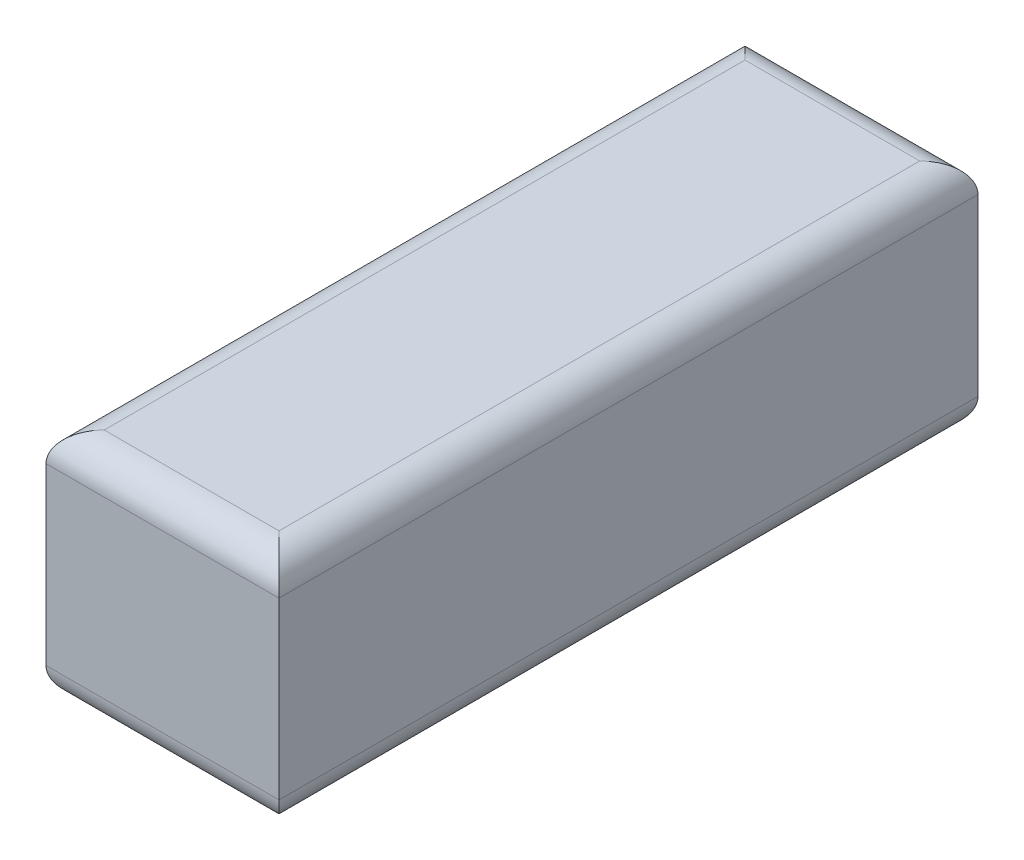
ISO-10303-21;
HEADER;
FILE_DESCRIPTION(('STEP AP214'),'2;1');
FILE_NAME('part.step','',(''),(''),'','','');
FILE_SCHEMA(('AUTOMOTIVE_DESIGN { 1 0 10303 214 1 1 1 1 }'));
ENDSEC;
DATA;
#1=APPLICATION_CONTEXT('core data for automotive mechanical design processes');
#2=APPLICATION_PROTOCOL_DEFINITION('international standard','automotive_design',2000,#1);
#3=PRODUCT_CONTEXT('',#1,'mechanical');
#4=PRODUCT('Part','Part','',(#3));
#5=PRODUCT_RELATED_PRODUCT_CATEGORY('part','',(#4));
#6=PRODUCT_DEFINITION_FORMATION('','',#4);
#7=PRODUCT_DEFINITION_CONTEXT('part definition',#1,'design');
#8=PRODUCT_DEFINITION('design','',#6,#7);
#9=PRODUCT_DEFINITION_SHAPE('','',#8);
#10=(LENGTH_UNIT() NAMED_UNIT(*) SI_UNIT(.MILLI.,.METRE.));
#11=(NAMED_UNIT(*) PLANE_ANGLE_UNIT() SI_UNIT($,.RADIAN.));
#12=(NAMED_UNIT(*) SI_UNIT($,.STERADIAN.) SOLID_ANGLE_UNIT());
#13=UNCERTAINTY_MEASURE_WITH_UNIT(LENGTH_MEASURE(1.E-05),#10,'distance_accuracy_value','');
#14=(GEOMETRIC_REPRESENTATION_CONTEXT(3) GLOBAL_UNCERTAINTY_ASSIGNED_CONTEXT((#13)) GLOBAL_UNIT_ASSIGNED_CONTEXT((#10,
#11,#12)) REPRESENTATION_CONTEXT('',''));
#15=CARTESIAN_POINT('',(0.,0.,0.));
#16=DIRECTION('',(0.,0.,1.));
#17=DIRECTION('',(1.,0.,0.));
#18=AXIS2_PLACEMENT_3D('',#15,#16,#17);
#19=CARTESIAN_POINT('',(-304.8,-304.8,1828.8));
#20=DIRECTION('',(1.,0.,0.));
#21=DIRECTION('',(0.,0.,-1.));
#22=AXIS2_PLACEMENT_3D('',#19,#20,#21);
#23=PLANE('',#22);
#24=DIRECTION('',(0.,-1.,0.));
#25=VECTOR('',#24,1.);
#26=CARTESIAN_POINT('',(-304.8,-304.8,0.));
#27=LINE('',#26,#25);
#28=CARTESIAN_POINT('',(-304.8,228.6,0.));
#29=VERTEX_POINT('',#28);
#30=CARTESIAN_POINT('',(-304.8,-228.6,0.));
#31=VERTEX_POINT('',#30);
#32=EDGE_CURVE('E138',#29,#31,#27,.T.);
#33=ORIENTED_EDGE('',*,*,#32,.T.);
#34=DIRECTION('',(0.,0.,-1.));
#35=VECTOR('',#34,1.);
#36=CARTESIAN_POINT('',(-304.8,-228.6,1828.8));
#37=LINE('',#36,#35);
#38=CARTESIAN_POINT('',(-304.8,-228.6,1828.8));
#39=VERTEX_POINT('',#38);
#40=EDGE_CURVE('E186',#31,#39,#37,.F.);
#41=ORIENTED_EDGE('',*,*,#40,.T.);
#42=DIRECTION('',(0.,-1.,0.));
#43=VECTOR('',#42,1.);
#44=CARTESIAN_POINT('',(-304.8,-304.8,1828.8));
#45=LINE('',#44,#43);
#46=CARTESIAN_POINT('',(-304.8,228.6,1828.8));
#47=VERTEX_POINT('',#46);
#48=EDGE_CURVE('E148',#47,#39,#45,.T.);
#49=ORIENTED_EDGE('',*,*,#48,.F.);
#50=DIRECTION('',(0.,0.,-1.));
#51=VECTOR('',#50,1.);
#52=CARTESIAN_POINT('',(-304.8,228.6,1828.8));
#53=LINE('',#52,#51);
#54=EDGE_CURVE('E183',#47,#29,#53,.T.);
#55=ORIENTED_EDGE('',*,*,#54,.T.);
#56=EDGE_LOOP('',(#33,#41,#49,#55));
#57=FACE_BOUND('',#56,.T.);
#58=ADVANCED_FACE('F49',(#57),#23,.F.);
#59=CARTESIAN_POINT('',(304.8,-304.8,1828.8));
#60=DIRECTION('',(0.,1.,0.));
#61=DIRECTION('',(-1.,0.,0.));
#62=AXIS2_PLACEMENT_3D('',#59,#60,#61);
#63=PLANE('',#62);
#64=DIRECTION('',(1.,0.,0.));
#65=VECTOR('',#64,1.);
#66=CARTESIAN_POINT('',(-304.8,-304.8,1752.6));
#67=LINE('',#66,#65);
#68=CARTESIAN_POINT('',(228.6,-304.8,1752.6));
#69=VERTEX_POINT('',#68);
#70=CARTESIAN_POINT('',(-228.6,-304.8,1752.6));
#71=VERTEX_POINT('',#70);
#72=EDGE_CURVE('E169',#69,#71,#67,.F.);
#73=ORIENTED_EDGE('',*,*,#72,.T.);
#74=DIRECTION('',(0.,0.,-1.));
#75=VECTOR('',#74,1.);
#76=CARTESIAN_POINT('',(-228.6,-304.8,1828.8));
#77=LINE('',#76,#75);
#78=CARTESIAN_POINT('',(-228.6,-304.8,76.2));
#79=VERTEX_POINT('',#78);
#80=EDGE_CURVE('E176',#71,#79,#77,.T.);
#81=ORIENTED_EDGE('',*,*,#80,.T.);
#82=DIRECTION('',(1.,0.,0.));
#83=VECTOR('',#82,1.);
#84=CARTESIAN_POINT('',(304.8,-304.8,76.2));
#85=LINE('',#84,#83);
#86=CARTESIAN_POINT('',(228.6,-304.8,76.2));
#87=VERTEX_POINT('',#86);
#88=EDGE_CURVE('E172',#79,#87,#85,.T.);
#89=ORIENTED_EDGE('',*,*,#88,.T.);
#90=DIRECTION('',(0.,0.,-1.));
#91=VECTOR('',#90,1.);
#92=CARTESIAN_POINT('',(228.6,-304.8,1828.8));
#93=LINE('',#92,#91);
#94=EDGE_CURVE('E166',#87,#69,#93,.F.);
#95=ORIENTED_EDGE('',*,*,#94,.T.);
#96=EDGE_LOOP('',(#73,#81,#89,#95));
#97=FACE_BOUND('',#96,.T.);
#98=ADVANCED_FACE('F235',(#97),#63,.F.);
#99=CARTESIAN_POINT('',(304.8,-304.8,1828.8));
#100=DIRECTION('',(-1.,0.,0.));
#101=DIRECTION('',(0.,0.,1.));
#102=AXIS2_PLACEMENT_3D('',#99,#100,#101);
#103=PLANE('',#102);
#104=DIRECTION('',(0.,1.,0.));
#105=VECTOR('',#104,1.);
#106=CARTESIAN_POINT('',(304.8,-304.8,0.));
#107=LINE('',#106,#105);
#108=CARTESIAN_POINT('',(304.8,-228.6,0.));
#109=VERTEX_POINT('',#108);
#110=CARTESIAN_POINT('',(304.8,228.6,0.));
#111=VERTEX_POINT('',#110);
#112=EDGE_CURVE('E151',#109,#111,#107,.T.);
#113=ORIENTED_EDGE('',*,*,#112,.T.);
#114=DIRECTION('',(0.,0.,-1.));
#115=VECTOR('',#114,1.);
#116=CARTESIAN_POINT('',(304.8,228.6,1828.8));
#117=LINE('',#116,#115);
#118=CARTESIAN_POINT('',(304.8,228.6,1828.8));
#119=VERTEX_POINT('',#118);
#120=EDGE_CURVE('E11',#111,#119,#117,.F.);
#121=ORIENTED_EDGE('',*,*,#120,.T.);
#122=DIRECTION('',(0.,1.,0.));
#123=VECTOR('',#122,1.);
#124=CARTESIAN_POINT('',(304.8,-304.8,1828.8));
#125=LINE('',#124,#123);
#126=CARTESIAN_POINT('',(304.8,-228.6,1828.8));
#127=VERTEX_POINT('',#126);
#128=EDGE_CURVE('E145',#127,#119,#125,.T.);
#129=ORIENTED_EDGE('',*,*,#128,.F.);
#130=DIRECTION('',(0.,0.,-1.));
#131=VECTOR('',#130,1.);
#132=CARTESIAN_POINT('',(304.8,-228.6,1828.8));
#133=LINE('',#132,#131);
#134=EDGE_CURVE('E59',#127,#109,#133,.T.);
#135=ORIENTED_EDGE('',*,*,#134,.T.);
#136=EDGE_LOOP('',(#113,#121,#129,#135));
#137=FACE_BOUND('',#136,.T.);
#138=ADVANCED_FACE('F223',(#137),#103,.F.);
#139=CARTESIAN_POINT('',(304.8,304.8,1828.8));
#140=DIRECTION('',(0.,-1.,0.));
#141=DIRECTION('',(1.,0.,0.));
#142=AXIS2_PLACEMENT_3D('',#139,#140,#141);
#143=PLANE('',#142);
#144=DIRECTION('',(-1.,0.,0.));
#145=VECTOR('',#144,1.);
#146=CARTESIAN_POINT('',(304.8,304.8,76.2));
#147=LINE('',#146,#145);
#148=CARTESIAN_POINT('',(228.6,304.8,76.2));
#149=VERTEX_POINT('',#148);
#150=CARTESIAN_POINT('',(-228.6,304.8,76.2));
#151=VERTEX_POINT('',#150);
#152=EDGE_CURVE('E129',#149,#151,#147,.T.);
#153=ORIENTED_EDGE('',*,*,#152,.T.);
#154=DIRECTION('',(0.,0.,-1.));
#155=VECTOR('',#154,1.);
#156=CARTESIAN_POINT('',(-228.6,304.8,1828.8));
#157=LINE('',#156,#155);
#158=CARTESIAN_POINT('',(-228.6,304.8,1752.6));
#159=VERTEX_POINT('',#158);
#160=EDGE_CURVE('E124',#151,#159,#157,.F.);
#161=ORIENTED_EDGE('',*,*,#160,.T.);
#162=DIRECTION('',(-1.,0.,0.));
#163=VECTOR('',#162,1.);
#164=CARTESIAN_POINT('',(304.8,304.8,1752.6));
#165=LINE('',#164,#163);
#166=CARTESIAN_POINT('',(228.6,304.8,1752.6));
#167=VERTEX_POINT('',#166);
#168=EDGE_CURVE('E116',#159,#167,#165,.F.);
#169=ORIENTED_EDGE('',*,*,#168,.T.);
#170=DIRECTION('',(0.,0.,-1.));
#171=VECTOR('',#170,1.);
#172=CARTESIAN_POINT('',(228.6,304.8,1828.8));
#173=LINE('',#172,#171);
#174=EDGE_CURVE('E121',#167,#149,#173,.T.);
#175=ORIENTED_EDGE('',*,*,#174,.T.);
#176=EDGE_LOOP('',(#153,#161,#169,#175));
#177=FACE_BOUND('',#176,.T.);
#178=ADVANCED_FACE('F119',(#177),#143,.F.);
#179=CARTESIAN_POINT('',(0.,0.,1828.8));
#180=DIRECTION('',(0.,0.,1.));
#181=DIRECTION('',(1.,0.,0.));
#182=AXIS2_PLACEMENT_3D('',#179,#180,#181);
#183=PLANE('',#182);
#184=ORIENTED_EDGE('',*,*,#128,.T.);
#185=DIRECTION('',(-1.,0.,0.));
#186=VECTOR('',#185,1.);
#187=CARTESIAN_POINT('',(-304.8,228.6,1828.8));
#188=LINE('',#187,#186);
#189=EDGE_CURVE('E135',#119,#47,#188,.T.);
#190=ORIENTED_EDGE('',*,*,#189,.T.);
#191=ORIENTED_EDGE('',*,*,#48,.T.);
#192=DIRECTION('',(1.,0.,0.));
#193=VECTOR('',#192,1.);
#194=CARTESIAN_POINT('',(304.8,-228.6,1828.8));
#195=LINE('',#194,#193);
#196=EDGE_CURVE('E72',#39,#127,#195,.T.);
#197=ORIENTED_EDGE('',*,*,#196,.T.);
#198=EDGE_LOOP('',(#184,#190,#191,#197));
#199=FACE_BOUND('',#198,.T.);
#200=ADVANCED_FACE('F297',(#199),#183,.T.);
#201=CARTESIAN_POINT('',(0.,0.,0.));
#202=DIRECTION('',(0.,0.,1.));
#203=DIRECTION('',(1.,0.,0.));
#204=AXIS2_PLACEMENT_3D('',#201,#202,#203);
#205=PLANE('',#204);
#206=ORIENTED_EDGE('',*,*,#32,.F.);
#207=DIRECTION('',(-1.,0.,0.));
#208=VECTOR('',#207,1.);
#209=CARTESIAN_POINT('',(0.,228.6,0.));
#210=LINE('',#209,#208);
#211=EDGE_CURVE('E162',#29,#111,#210,.F.);
#212=ORIENTED_EDGE('',*,*,#211,.T.);
#213=ORIENTED_EDGE('',*,*,#112,.F.);
#214=DIRECTION('',(1.,0.,0.));
#215=VECTOR('',#214,1.);
#216=CARTESIAN_POINT('',(0.,-228.6,0.));
#217=LINE('',#216,#215);
#218=EDGE_CURVE('E158',#109,#31,#217,.F.);
#219=ORIENTED_EDGE('',*,*,#218,.T.);
#220=EDGE_LOOP('',(#206,#212,#213,#219));
#221=FACE_BOUND('',#220,.T.);
#222=ADVANCED_FACE('F227',(#221),#205,.F.);
#223=CARTESIAN_POINT('',(0.,228.6,1752.6));
#224=DIRECTION('',(1.,0.,0.));
#225=DIRECTION('',(0.,1.,0.));
#226=AXIS2_PLACEMENT_3D('',#223,#224,#225);
#227=CYLINDRICAL_SURFACE('',#226,76.2);
#228=CARTESIAN_POINT('',(-228.6,228.6,1752.6));
#229=DIRECTION('',(-0.707106781186547,0.,-0.707106781186547));
#230=DIRECTION('',(0.707106781186547,0.,-0.707106781186547));
#231=AXIS2_PLACEMENT_3D('',#228,#229,#230);
#232=ELLIPSE('',#231,107.76307345283,76.2);
#233=EDGE_CURVE('E139',#47,#159,#232,.T.);
#234=ORIENTED_EDGE('',*,*,#233,.F.);
#235=ORIENTED_EDGE('',*,*,#189,.F.);
#236=CARTESIAN_POINT('',(228.6,228.6,1752.6));
#237=DIRECTION('',(0.707106781186547,0.,-0.707106781186547));
#238=DIRECTION('',(-0.707106781186547,0.,-0.707106781186547));
#239=AXIS2_PLACEMENT_3D('',#236,#237,#238);
#240=ELLIPSE('',#239,107.76307345283,76.2);
#241=EDGE_CURVE('E133',#167,#119,#240,.T.);
#242=ORIENTED_EDGE('',*,*,#241,.F.);
#243=ORIENTED_EDGE('',*,*,#168,.F.);
#244=EDGE_LOOP('',(#234,#235,#242,#243));
#245=FACE_BOUND('',#244,.T.);
#246=ADVANCED_FACE('F134',(#245),#227,.T.);
#247=CARTESIAN_POINT('',(228.6,228.6,1828.8));
#248=DIRECTION('',(0.,0.,-1.));
#249=DIRECTION('',(-1.,0.,0.));
#250=AXIS2_PLACEMENT_3D('',#247,#248,#249);
#251=CYLINDRICAL_SURFACE('',#250,76.2);
#252=ORIENTED_EDGE('',*,*,#241,.T.);
#253=ORIENTED_EDGE('',*,*,#120,.F.);
#254=CARTESIAN_POINT('',(228.6,228.6,76.2));
#255=DIRECTION('',(-0.707106781186547,0.,-0.707106781186547));
#256=DIRECTION('',(0.707106781186547,0.,-0.707106781186547));
#257=AXIS2_PLACEMENT_3D('',#254,#255,#256);
#258=ELLIPSE('',#257,107.76307345283,76.2);
#259=EDGE_CURVE('E142',#149,#111,#258,.T.);
#260=ORIENTED_EDGE('',*,*,#259,.F.);
#261=ORIENTED_EDGE('',*,*,#174,.F.);
#262=EDGE_LOOP('',(#252,#253,#260,#261));
#263=FACE_BOUND('',#262,.T.);
#264=ADVANCED_FACE('F141',(#263),#251,.T.);
#265=CARTESIAN_POINT('',(-228.6,228.6,1828.8));
#266=DIRECTION('',(0.,0.,-1.));
#267=DIRECTION('',(-1.,0.,0.));
#268=AXIS2_PLACEMENT_3D('',#265,#266,#267);
#269=CYLINDRICAL_SURFACE('',#268,76.2);
#270=ORIENTED_EDGE('',*,*,#233,.T.);
#271=ORIENTED_EDGE('',*,*,#160,.F.);
#272=CARTESIAN_POINT('',(-228.6,228.6,76.2));
#273=DIRECTION('',(0.707106781186547,0.,-0.707106781186547));
#274=DIRECTION('',(-0.707106781186547,0.,-0.707106781186547));
#275=AXIS2_PLACEMENT_3D('',#272,#273,#274);
#276=ELLIPSE('',#275,107.76307345283,76.2);
#277=EDGE_CURVE('E191',#29,#151,#276,.T.);
#278=ORIENTED_EDGE('',*,*,#277,.F.);
#279=ORIENTED_EDGE('',*,*,#54,.F.);
#280=EDGE_LOOP('',(#270,#271,#278,#279));
#281=FACE_BOUND('',#280,.T.);
#282=ADVANCED_FACE('F250',(#281),#269,.T.);
#283=CARTESIAN_POINT('',(304.8,228.6,76.2));
#284=DIRECTION('',(-1.,0.,0.));
#285=DIRECTION('',(0.,-1.,0.));
#286=AXIS2_PLACEMENT_3D('',#283,#284,#285);
#287=CYLINDRICAL_SURFACE('',#286,76.2);
#288=ORIENTED_EDGE('',*,*,#259,.T.);
#289=ORIENTED_EDGE('',*,*,#211,.F.);
#290=ORIENTED_EDGE('',*,*,#277,.T.);
#291=ORIENTED_EDGE('',*,*,#152,.F.);
#292=EDGE_LOOP('',(#288,#289,#290,#291));
#293=FACE_BOUND('',#292,.T.);
#294=ADVANCED_FACE('F247',(#293),#287,.T.);
#295=CARTESIAN_POINT('',(0.,-228.6,1752.6));
#296=DIRECTION('',(-1.,0.,0.));
#297=DIRECTION('',(0.,-1.,0.));
#298=AXIS2_PLACEMENT_3D('',#295,#296,#297);
#299=CYLINDRICAL_SURFACE('',#298,76.2);
#300=CARTESIAN_POINT('',(228.6,-228.6,1752.6));
#301=DIRECTION('',(0.707106781186547,0.,-0.707106781186547));
#302=DIRECTION('',(-0.707106781186547,0.,-0.707106781186547));
#303=AXIS2_PLACEMENT_3D('',#300,#301,#302);
#304=ELLIPSE('',#303,107.76307345283,76.2);
#305=EDGE_CURVE('E203',#127,#69,#304,.T.);
#306=ORIENTED_EDGE('',*,*,#305,.F.);
#307=ORIENTED_EDGE('',*,*,#196,.F.);
#308=CARTESIAN_POINT('',(-228.6,-228.6,1752.6));
#309=DIRECTION('',(-0.707106781186547,0.,-0.707106781186547));
#310=DIRECTION('',(0.707106781186547,0.,-0.707106781186547));
#311=AXIS2_PLACEMENT_3D('',#308,#309,#310);
#312=ELLIPSE('',#311,107.76307345283,76.2);
#313=EDGE_CURVE('E53',#71,#39,#312,.T.);
#314=ORIENTED_EDGE('',*,*,#313,.F.);
#315=ORIENTED_EDGE('',*,*,#72,.F.);
#316=EDGE_LOOP('',(#306,#307,#314,#315));
#317=FACE_BOUND('',#316,.T.);
#318=ADVANCED_FACE('F51',(#317),#299,.T.);
#319=CARTESIAN_POINT('',(-228.6,-228.6,1828.8));
#320=DIRECTION('',(0.,0.,-1.));
#321=DIRECTION('',(-1.,0.,0.));
#322=AXIS2_PLACEMENT_3D('',#319,#320,#321);
#323=CYLINDRICAL_SURFACE('',#322,76.2);
#324=ORIENTED_EDGE('',*,*,#313,.T.);
#325=ORIENTED_EDGE('',*,*,#40,.F.);
#326=CARTESIAN_POINT('',(-228.6,-228.6,76.2));
#327=DIRECTION('',(0.707106781186547,0.,-0.707106781186547));
#328=DIRECTION('',(-0.707106781186547,0.,-0.707106781186547));
#329=AXIS2_PLACEMENT_3D('',#326,#327,#328);
#330=ELLIPSE('',#329,107.76307345283,76.2);
#331=EDGE_CURVE('E201',#79,#31,#330,.T.);
#332=ORIENTED_EDGE('',*,*,#331,.F.);
#333=ORIENTED_EDGE('',*,*,#80,.F.);
#334=EDGE_LOOP('',(#324,#325,#332,#333));
#335=FACE_BOUND('',#334,.T.);
#336=ADVANCED_FACE('F216',(#335),#323,.T.);
#337=CARTESIAN_POINT('',(228.6,-228.6,1828.8));
#338=DIRECTION('',(0.,0.,-1.));
#339=DIRECTION('',(-1.,0.,0.));
#340=AXIS2_PLACEMENT_3D('',#337,#338,#339);
#341=CYLINDRICAL_SURFACE('',#340,76.2);
#342=ORIENTED_EDGE('',*,*,#305,.T.);
#343=ORIENTED_EDGE('',*,*,#94,.F.);
#344=CARTESIAN_POINT('',(228.6,-228.6,76.2));
#345=DIRECTION('',(-0.707106781186547,0.,-0.707106781186547));
#346=DIRECTION('',(0.707106781186547,0.,-0.707106781186547));
#347=AXIS2_PLACEMENT_3D('',#344,#345,#346);
#348=ELLIPSE('',#347,107.76307345283,76.2);
#349=EDGE_CURVE('E198',#109,#87,#348,.T.);
#350=ORIENTED_EDGE('',*,*,#349,.F.);
#351=ORIENTED_EDGE('',*,*,#134,.F.);
#352=EDGE_LOOP('',(#342,#343,#350,#351));
#353=FACE_BOUND('',#352,.T.);
#354=ADVANCED_FACE('F221',(#353),#341,.T.);
#355=CARTESIAN_POINT('',(304.8,-228.6,76.2));
#356=DIRECTION('',(1.,0.,0.));
#357=DIRECTION('',(0.,1.,0.));
#358=AXIS2_PLACEMENT_3D('',#355,#356,#357);
#359=CYLINDRICAL_SURFACE('',#358,76.2);
#360=ORIENTED_EDGE('',*,*,#331,.T.);
#361=ORIENTED_EDGE('',*,*,#218,.F.);
#362=ORIENTED_EDGE('',*,*,#349,.T.);
#363=ORIENTED_EDGE('',*,*,#88,.F.);
#364=EDGE_LOOP('',(#360,#361,#362,#363));
#365=FACE_BOUND('',#364,.T.);
#366=ADVANCED_FACE('F232',(#365),#359,.T.);
#367=CLOSED_SHELL('',(#58,#98,#138,#178,#200,#222,#246,#264,#282,#294,#318,#336,#354,#366));
#368=MANIFOLD_SOLID_BREP('B2',#367);
#369=ADVANCED_BREP_SHAPE_REPRESENTATION('',(#18,#368),#14);
#370=SHAPE_DEFINITION_REPRESENTATION(#9,#369);
ENDSEC;
END-ISO-10303-21;
